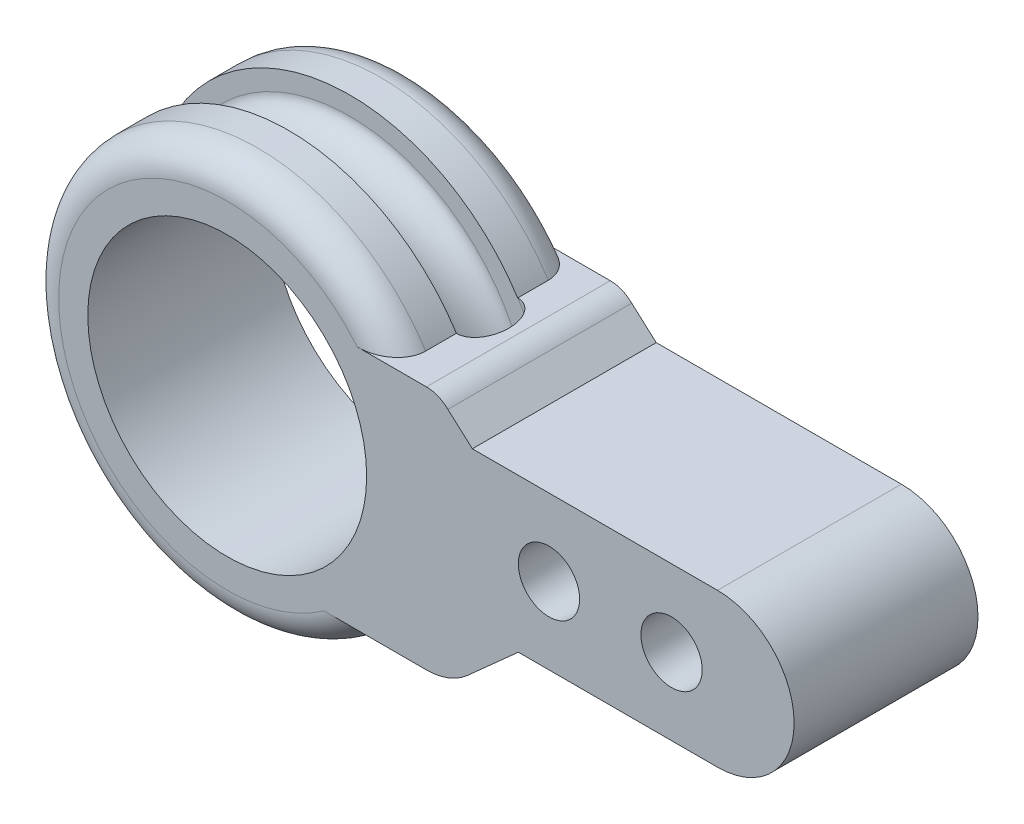
ISO-10303-21;
HEADER;
FILE_DESCRIPTION(('STEP AP214'),'2;1');
FILE_NAME('part.step','',(''),(''),'','','');
FILE_SCHEMA(('AUTOMOTIVE_DESIGN { 1 0 10303 214 1 1 1 1 }'));
ENDSEC;
DATA;
#1=APPLICATION_CONTEXT('core data for automotive mechanical design processes');
#2=APPLICATION_PROTOCOL_DEFINITION('international standard','automotive_design',2000,#1);
#3=PRODUCT_CONTEXT('',#1,'mechanical');
#4=PRODUCT('Part','Part','',(#3));
#5=PRODUCT_RELATED_PRODUCT_CATEGORY('part','',(#4));
#6=PRODUCT_DEFINITION_FORMATION('','',#4);
#7=PRODUCT_DEFINITION_CONTEXT('part definition',#1,'design');
#8=PRODUCT_DEFINITION('design','',#6,#7);
#9=PRODUCT_DEFINITION_SHAPE('','',#8);
#10=(LENGTH_UNIT() NAMED_UNIT(*) SI_UNIT(.MILLI.,.METRE.));
#11=(NAMED_UNIT(*) PLANE_ANGLE_UNIT() SI_UNIT($,.RADIAN.));
#12=(NAMED_UNIT(*) SI_UNIT($,.STERADIAN.) SOLID_ANGLE_UNIT());
#13=UNCERTAINTY_MEASURE_WITH_UNIT(LENGTH_MEASURE(1.E-05),#10,'distance_accuracy_value','');
#14=(GEOMETRIC_REPRESENTATION_CONTEXT(3) GLOBAL_UNCERTAINTY_ASSIGNED_CONTEXT((#13)) GLOBAL_UNIT_ASSIGNED_CONTEXT((#10,
#11,#12)) REPRESENTATION_CONTEXT('',''));
#15=CARTESIAN_POINT('',(0.,0.,0.));
#16=DIRECTION('',(0.,0.,1.));
#17=DIRECTION('',(1.,0.,0.));
#18=AXIS2_PLACEMENT_3D('',#15,#16,#17);
#19=CARTESIAN_POINT('',(4.69041575982343,-4.5,6.));
#20=DIRECTION('',(0.,1.,0.));
#21=DIRECTION('',(-1.,0.,0.));
#22=AXIS2_PLACEMENT_3D('',#19,#20,#21);
#23=PLANE('',#22);
#24=DIRECTION('',(1.,0.,0.));
#25=VECTOR('',#24,1.);
#26=CARTESIAN_POINT('',(4.69041575982343,-4.5,1.99843119348952));
#27=LINE('',#26,#25);
#28=CARTESIAN_POINT('',(4.69041575982343,-4.5,1.99843119348952));
#29=VERTEX_POINT('',#28);
#30=CARTESIAN_POINT('',(4.70292640209629,-4.5,1.99843119348952));
#31=VERTEX_POINT('',#30);
#32=EDGE_CURVE('E419',#29,#31,#27,.T.);
#33=ORIENTED_EDGE('',*,*,#32,.F.);
#34=DIRECTION('',(0.,0.,-1.));
#35=VECTOR('',#34,1.);
#36=CARTESIAN_POINT('',(4.69041575982343,-4.5,6.));
#37=LINE('',#36,#35);
#38=CARTESIAN_POINT('',(4.69041575982343,-4.5,1.));
#39=VERTEX_POINT('',#38);
#40=EDGE_CURVE('E268',#29,#39,#37,.T.);
#41=ORIENTED_EDGE('',*,*,#40,.T.);
#42=CARTESIAN_POINT('',(4.69041575982343,-4.5,1.));
#43=CARTESIAN_POINT('',(4.69041895160302,-4.5,0.977596962681445));
#44=CARTESIAN_POINT('',(4.68937157425843,-4.5,0.955207057747566));
#45=CARTESIAN_POINT('',(4.68521616480886,-4.5,0.910632809517849));
#46=CARTESIAN_POINT('',(4.68210939947018,-4.5,0.888448348350542));
#47=CARTESIAN_POINT('',(4.66982612496238,-4.5,0.822790708875952));
#48=CARTESIAN_POINT('',(4.65768511580106,-4.5,0.779841263067524));
#49=CARTESIAN_POINT('',(4.62632006257186,-4.5,0.696777562864503));
#50=CARTESIAN_POINT('',(4.60711079454571,-4.5,0.656657600513556));
#51=CARTESIAN_POINT('',(4.56266708575891,-4.5,0.579849110902098));
#52=CARTESIAN_POINT('',(4.53742118853803,-4.5,0.543167295161549));
#53=CARTESIAN_POINT('',(4.47226544089342,-4.5,0.461460940375679));
#54=CARTESIAN_POINT('',(4.43032431253609,-4.5,0.418058028759857));
#55=CARTESIAN_POINT('',(4.34001880309513,-4.5,0.338628278531945));
#56=CARTESIAN_POINT('',(4.29164651469831,-4.5,0.3026106612394));
#57=CARTESIAN_POINT('',(4.16946904904454,-4.5,0.224136153481156));
#58=CARTESIAN_POINT('',(4.09342300154608,-4.5,0.185182725976463));
#59=CARTESIAN_POINT('',(3.93602307554942,-4.5,0.119558493808312));
#60=CARTESIAN_POINT('',(3.85464673110043,-4.5,0.0929440795744107));
#61=CARTESIAN_POINT('',(3.67187471932509,-4.5,0.0459308111345104));
#62=CARTESIAN_POINT('',(3.56985290987806,-4.5,0.027997633010357));
#63=CARTESIAN_POINT('',(3.41657183091047,-4.5,0.010799396846525));
#64=CARTESIAN_POINT('',(3.36576389273019,-4.5,0.00667965331845016));
#65=CARTESIAN_POINT('',(3.26406573483153,-4.5,0.00128492215607739));
#66=CARTESIAN_POINT('',(3.21317572958382,-4.5,5.96381343863645E-06));
#67=CARTESIAN_POINT('',(3.16227766016838,-4.5,0.));
#68=B_SPLINE_CURVE_WITH_KNOTS('',3,(#42,#43,#44,#45,#46,#47,#48,#49,#50,#51,#52,#53,#54,#55,#56,
#57,#58,#59,#60,#61,#62,#63,#64,#65,#66,#67),.UNSPECIFIED.,.F.,.F.,(4,2,2,2,2,2,2,2,2,2,2,2,4),
(0.,0.0671595457267031,0.134277818706003,0.267415237717757,0.400275902561032,0.533390743304169,
0.71346268475732,0.893758113991914,1.14866535996151,1.40472634296297,1.71436429513972,
1.86723157216634,2.01988504409302),.UNSPECIFIED.);
#69=CARTESIAN_POINT('',(3.16227766016838,-4.5,0.));
#70=VERTEX_POINT('',#69);
#71=EDGE_CURVE('E47',#39,#70,#68,.T.);
#72=ORIENTED_EDGE('',*,*,#71,.T.);
#73=DIRECTION('',(1.,0.,0.));
#74=VECTOR('',#73,1.);
#75=CARTESIAN_POINT('',(4.69041575982343,-4.5,0.));
#76=LINE('',#75,#74);
#77=CARTESIAN_POINT('',(6.5,-4.5,0.));
#78=VERTEX_POINT('',#77);
#79=EDGE_CURVE('E54',#70,#78,#76,.T.);
#80=ORIENTED_EDGE('',*,*,#79,.T.);
#81=DIRECTION('',(0.,0.,-1.));
#82=VECTOR('',#81,1.);
#83=CARTESIAN_POINT('',(6.5,-4.5,6.));
#84=LINE('',#83,#82);
#85=CARTESIAN_POINT('',(6.5,-4.5,6.));
#86=VERTEX_POINT('',#85);
#87=EDGE_CURVE('E340',#86,#78,#84,.T.);
#88=ORIENTED_EDGE('',*,*,#87,.F.);
#89=DIRECTION('',(1.,0.,0.));
#90=VECTOR('',#89,1.);
#91=CARTESIAN_POINT('',(4.69041575982343,-4.5,6.));
#92=LINE('',#91,#90);
#93=CARTESIAN_POINT('',(3.16227766016838,-4.5,6.));
#94=VERTEX_POINT('',#93);
#95=EDGE_CURVE('E293',#94,#86,#92,.T.);
#96=ORIENTED_EDGE('',*,*,#95,.F.);
#97=CARTESIAN_POINT('',(3.16227766016838,-4.5,6.));
#98=CARTESIAN_POINT('',(3.23334602524907,-4.5,5.99998033821577));
#99=CARTESIAN_POINT('',(3.30448749517695,-4.5,5.99749182801016));
#100=CARTESIAN_POINT('',(3.44672645470219,-4.5,5.98672979872865));
#101=CARTESIAN_POINT('',(3.51782139924733,-4.5,5.97842350075403));
#102=CARTESIAN_POINT('',(3.65997427657541,-4.5,5.95499217687569));
#103=CARTESIAN_POINT('',(3.73101687861788,-4.5,5.93977050859863));
#104=CARTESIAN_POINT('',(3.87082373400252,-4.5,5.90150699790859));
#105=CARTESIAN_POINT('',(3.93959341888812,-4.5,5.87848554155266));
#106=CARTESIAN_POINT('',(4.06624410155655,-4.5,5.82651299870175));
#107=CARTESIAN_POINT('',(4.12449603988664,-4.5,5.79847874236156));
#108=CARTESIAN_POINT('',(4.23646619167923,-4.5,5.73462258342951));
#109=CARTESIAN_POINT('',(4.29019492578419,-4.5,5.69881948655014));
#110=CARTESIAN_POINT('',(4.3918287901696,-4.5,5.61825053952235));
#111=CARTESIAN_POINT('',(4.43964083033386,-4.5,5.57336511248957));
#112=CARTESIAN_POINT('',(4.52542100161149,-4.5,5.47495257830984));
#113=CARTESIAN_POINT('',(4.5634127753495,-4.5,5.42144673940803));
#114=CARTESIAN_POINT('',(4.61540416021045,-4.5,5.32652159446845));
#115=CARTESIAN_POINT('',(4.63317141884252,-4.5,5.2871489894753));
#116=CARTESIAN_POINT('',(4.66188879039873,-4.5,5.20601656977274));
#117=CARTESIAN_POINT('',(4.6728530888088,-4.5,5.16426192209058));
#118=CARTESIAN_POINT('',(4.68350626076316,-4.5,5.10177738521324));
#119=CARTESIAN_POINT('',(4.68609279998752,-4.5,5.08150807302189));
#120=CARTESIAN_POINT('',(4.6895480146711,-4.5,5.04082953434972));
#121=CARTESIAN_POINT('',(4.69041717600019,-4.5,5.02042034908106));
#122=CARTESIAN_POINT('',(4.69041575982343,-4.5,5.));
#123=B_SPLINE_CURVE_WITH_KNOTS('',3,(#97,#98,#99,#100,#101,#102,#103,#104,#105,#106,#107,#108,
#109,#110,#111,#112,#113,#114,#115,#116,#117,#118,#119,#120,#121,#122),.UNSPECIFIED.,.F.,.F.,(4,
2,2,2,2,2,2,2,2,2,2,2,4),(0.,0.213273306136751,0.427758017013181,0.645337015500823,
0.862351666366933,1.05577156620666,1.24872838422298,1.44441366042992,1.63962333486838,
1.76869656026797,1.89749973050446,1.9587380109012,2.01995896366226),.UNSPECIFIED.);
#124=CARTESIAN_POINT('',(4.69041575982343,-4.5,5.));
#125=VERTEX_POINT('',#124);
#126=EDGE_CURVE('E245',#94,#125,#123,.T.);
#127=ORIENTED_EDGE('',*,*,#126,.T.);
#128=CARTESIAN_POINT('',(4.69041575982343,-4.5,3.99843119348952));
#129=VERTEX_POINT('',#128);
#130=EDGE_CURVE('E281',#125,#129,#37,.T.);
#131=ORIENTED_EDGE('',*,*,#130,.T.);
#132=DIRECTION('',(-1.,0.,0.));
#133=VECTOR('',#132,1.);
#134=CARTESIAN_POINT('',(4.69041575982343,-4.5,3.99843119348952));
#135=LINE('',#134,#133);
#136=CARTESIAN_POINT('',(4.70292640209629,-4.5,3.99843119348952));
#137=VERTEX_POINT('',#136);
#138=EDGE_CURVE('E163',#137,#129,#135,.T.);
#139=ORIENTED_EDGE('',*,*,#138,.F.);
#140=CARTESIAN_POINT('',(4.70292640209629,-4.5,3.99843119348952));
#141=CARTESIAN_POINT('',(4.72207468590351,-4.5,3.99843271973142));
#142=CARTESIAN_POINT('',(4.74121543834601,-4.5,3.99763288816709));
#143=CARTESIAN_POINT('',(4.77935975373242,-4.5,3.99442474316628));
#144=CARTESIAN_POINT('',(4.79836332853766,-4.5,3.9920165705236));
#145=CARTESIAN_POINT('',(4.85481016934785,-4.5,3.98240134539255));
#146=CARTESIAN_POINT('',(4.89187442163675,-4.5,3.97280363814264));
#147=CARTESIAN_POINT('',(4.96389349180584,-4.5,3.9475660861733));
#148=CARTESIAN_POINT('',(4.9988462152444,-4.5,3.93192035256708));
#149=CARTESIAN_POINT('',(5.06582307625507,-4.5,3.89527247052552));
#150=CARTESIAN_POINT('',(5.09784573004788,-4.5,3.87426762842528));
#151=CARTESIAN_POINT('',(5.160105241582,-4.5,3.82646198950584));
#152=CARTESIAN_POINT('',(5.19014275559974,-4.5,3.79940318682905));
#153=CARTESIAN_POINT('',(5.24605900916883,-4.5,3.74128624906075));
#154=CARTESIAN_POINT('',(5.27193407593936,-4.5,3.71022462508352));
#155=CARTESIAN_POINT('',(5.32981505981013,-4.49999999999999,3.63078057260934));
#156=CARTESIAN_POINT('',(5.35957151279928,-4.5,3.58075320388895));
#157=CARTESIAN_POINT('',(5.4105568749744,-4.5,3.47650824115331));
#158=CARTESIAN_POINT('',(5.43176952929273,-4.5,3.42228289172068));
#159=CARTESIAN_POINT('',(5.46620618165703,-4.5,3.31058945504277));
#160=CARTESIAN_POINT('',(5.47932081755871,-4.5,3.25308796620198));
#161=CARTESIAN_POINT('',(5.49740336618089,-4.5,3.13684066750762));
#162=CARTESIAN_POINT('',(5.50236924315946,-4.5,3.07809455042982));
#163=CARTESIAN_POINT('',(5.50444749408797,-4.5,2.94918311772712));
#164=CARTESIAN_POINT('',(5.49988043192396,-4.5,2.87897788356932));
#165=CARTESIAN_POINT('',(5.48438422066897,-4.5,2.77505322904287));
#166=CARTESIAN_POINT('',(5.47777697614783,-4.5,2.74063942027466));
#167=CARTESIAN_POINT('',(5.46161164767258,-4.5,2.67245696694464));
#168=CARTESIAN_POINT('',(5.45204958425334,-4.5,2.63868925805532));
#169=CARTESIAN_POINT('',(5.42313927085772,-4.5,2.55181527365808));
#170=CARTESIAN_POINT('',(5.40138005963799,-4.5,2.49948404430528));
#171=CARTESIAN_POINT('',(5.34973106850188,-4.5,2.39905643090719));
#172=CARTESIAN_POINT('',(5.31985720578898,-4.5,2.35095199778716));
#173=CARTESIAN_POINT('',(5.25857196679343,-4.5,2.26992120421374));
#174=CARTESIAN_POINT('',(5.22864371462777,-4.5,2.23587766227944));
#175=CARTESIAN_POINT('',(5.16360038452457,-4.5,2.17312882273309));
#176=CARTESIAN_POINT('',(5.12848813479098,-4.5,2.14442063351282));
#177=CARTESIAN_POINT('',(5.0533176675696,-4.5,2.0935841153982));
#178=CARTESIAN_POINT('',(5.01322102475276,-4.5,2.07151204194681));
#179=CARTESIAN_POINT('',(4.92947886640111,-4.5,2.03566013697044));
#180=CARTESIAN_POINT('',(4.88583844254941,-4.5,2.02186863915999));
#181=CARTESIAN_POINT('',(4.81855408290306,-4.5,2.00787768386837));
#182=CARTESIAN_POINT('',(4.79556138993356,-4.49999999999999,2.00432958298985));
#183=CARTESIAN_POINT('',(4.74935851983353,-4.5,1.99960571947351));
#184=CARTESIAN_POINT('',(4.72614860689936,-4.50000000000002,1.99842737678428));
#185=CARTESIAN_POINT('',(4.70292640209645,-4.50000000000005,1.99843119348952));
#186=B_SPLINE_CURVE_WITH_KNOTS('',3,(#140,#141,#142,#143,#144,#145,#146,#147,#148,#149,#150,
#151,#152,#153,#154,#155,#156,#157,#158,#159,#160,#161,#162,#163,#164,#165,#166,#167,#168,#169,
#170,#171,#172,#173,#174,#175,#176,#177,#178,#179,#180,#181,#182,#183,#184,#185),.UNSPECIFIED.,
.F.,.F.,(4,2,2,2,2,2,2,2,2,2,2,2,2,2,2,2,2,2,2,2,2,2,4),(0.,0.0574123165189089,
0.114819607835953,0.229086746463998,0.34346542695295,0.457901711594274,0.57872331219648,
0.699650943138519,0.873330741760275,1.0473394287376,1.22364942249786,1.40000345572942,
1.61000957905854,1.71503002024462,1.82019252095396,1.98953592110764,2.15854951687747,
2.29400344121919,2.42938373795599,2.5658812607857,2.70218602181477,2.77187272151152,
2.84148350932177),.UNSPECIFIED.);
#187=EDGE_CURVE('E172',#137,#31,#186,.T.);
#188=ORIENTED_EDGE('',*,*,#187,.T.);
#189=EDGE_LOOP('',(#33,#41,#72,#80,#88,#96,#127,#131,#139,#188));
#190=FACE_BOUND('',#189,.T.);
#191=ADVANCED_FACE('F33',(#190),#23,.F.);
#192=CARTESIAN_POINT('',(6.5,3.5,6.));
#193=DIRECTION('',(0.,-1.,0.));
#194=DIRECTION('',(0.,0.,-1.));
#195=AXIS2_PLACEMENT_3D('',#192,#193,#194);
#196=PLANE('',#195);
#197=DIRECTION('',(-1.,0.,0.));
#198=VECTOR('',#197,1.);
#199=CARTESIAN_POINT('',(6.5,3.5,1.99843119348952));
#200=LINE('',#199,#198);
#201=CARTESIAN_POINT('',(5.48794285170084,3.5,1.99843119348952));
#202=VERTEX_POINT('',#201);
#203=CARTESIAN_POINT('',(5.47722557505166,3.5,1.99843119348952));
#204=VERTEX_POINT('',#203);
#205=EDGE_CURVE('E178',#202,#204,#200,.T.);
#206=ORIENTED_EDGE('',*,*,#205,.F.);
#207=CARTESIAN_POINT('',(5.48794285170084,3.5,1.99843119348952));
#208=CARTESIAN_POINT('',(5.50334077697644,3.4999999999999,1.9984286766703));
#209=CARTESIAN_POINT('',(5.51873038447994,3.49999999999995,1.99913415339519));
#210=CARTESIAN_POINT('',(5.54937369955001,3.50000000000005,2.00194097097522));
#211=CARTESIAN_POINT('',(5.56462747474249,3.5000000000001,2.00404157273644));
#212=CARTESIAN_POINT('',(5.6097774594412,3.4999999999998,2.01236035954246));
#213=CARTESIAN_POINT('',(5.6393236851537,3.49999999999903,2.02059633730872));
#214=CARTESIAN_POINT('',(5.69498668064814,3.49999999999904,2.04132870959261));
#215=CARTESIAN_POINT('',(5.72120270115804,3.49999999999974,2.05356563565131));
#216=CARTESIAN_POINT('',(5.77159901382026,3.50000000000026,2.08173744713488));
#217=CARTESIAN_POINT('',(5.79577582494572,3.50000000000008,2.09767848822722));
#218=CARTESIAN_POINT('',(5.85241785634997,3.49999999999988,2.14061564336957));
#219=CARTESIAN_POINT('',(5.8835852755012,3.49999999999997,2.16932534800375));
#220=CARTESIAN_POINT('',(5.94090551535545,3.50000000000003,2.2313753385966));
#221=CARTESIAN_POINT('',(5.96704720825796,3.50000000000001,2.26472562463979));
#222=CARTESIAN_POINT('',(6.02411747447867,3.49999999999998,2.34880985441148));
#223=CARTESIAN_POINT('',(6.05271289835628,3.49999999999999,2.4011233160703));
#224=CARTESIAN_POINT('',(6.10128344964254,3.5,2.50956187065349));
#225=CARTESIAN_POINT('',(6.12124610661421,3.5,2.5656923429724));
#226=CARTESIAN_POINT('',(6.15832025899222,3.5,2.69816835013827));
#227=CARTESIAN_POINT('',(6.17256010857777,3.5,2.77531920808124));
#228=CARTESIAN_POINT('',(6.18832586450009,3.5,2.93095971860675));
#229=CARTESIAN_POINT('',(6.18983212715318,3.5,3.00945125258897));
#230=CARTESIAN_POINT('',(6.18014917709243,3.5,3.16645897407841));
#231=CARTESIAN_POINT('',(6.16883160039567,3.5,3.24496740537847));
#232=CARTESIAN_POINT('',(6.13253704281409,3.5,3.39873058057227));
#233=CARTESIAN_POINT('',(6.10759624782825,3.49999999999999,3.47399337658704));
#234=CARTESIAN_POINT('',(6.05542227638354,3.5,3.58917721587477));
#235=CARTESIAN_POINT('',(6.0330064712661,3.5,3.63129286368753));
#236=CARTESIAN_POINT('',(5.98215475934092,3.5,3.71174513770186));
#237=CARTESIAN_POINT('',(5.95372752285852,3.5,3.75008709124759));
#238=CARTESIAN_POINT('',(5.89760733348578,3.5,3.81317205388966));
#239=CARTESIAN_POINT('',(5.87118047367267,3.5,3.83903612248418));
#240=CARTESIAN_POINT('',(5.81450546384123,3.5,3.88620516967662));
#241=CARTESIAN_POINT('',(5.78426195998072,3.5,3.90751560804633));
#242=CARTESIAN_POINT('',(5.72601965749903,3.5,3.94095882641076));
#243=CARTESIAN_POINT('',(5.69857196393368,3.5,3.95404859436561));
#244=CARTESIAN_POINT('',(5.64188554740443,3.5,3.97544930427055));
#245=CARTESIAN_POINT('',(5.61265019978921,3.5,3.98376896225516));
#246=CARTESIAN_POINT('',(5.56728751642629,3.5,3.99242267824039));
#247=CARTESIAN_POINT('',(5.55150642238929,3.5,3.99467261887462));
#248=CARTESIAN_POINT('',(5.51980071183317,3.5,3.9976785911847));
#249=CARTESIAN_POINT('',(5.50387607697789,3.5,3.99843442920462));
#250=CARTESIAN_POINT('',(5.48794285170084,3.5,3.99843119348952));
#251=B_SPLINE_CURVE_WITH_KNOTS('',3,(#207,#208,#209,#210,#211,#212,#213,#214,#215,#216,#217,
#218,#219,#220,#221,#222,#223,#224,#225,#226,#227,#228,#229,#230,#231,#232,#233,#234,#235,#236,
#237,#238,#239,#240,#241,#242,#243,#244,#245,#246,#247,#248,#249,#250),.UNSPECIFIED.,.F.,.F.,(4,
2,2,2,2,2,2,2,2,2,2,2,2,2,2,2,2,2,2,2,2,4),(0.,0.0461613460436265,0.0922982567252823,
0.183799597253196,0.270264260634804,0.356873655808186,0.483290182954039,0.609983472664503,
0.787863229072435,0.965999089704198,1.20016381297026,1.43468970862082,1.67158405832455,
1.90785220931492,2.05057454370532,2.19309241589198,2.30363635946471,2.41404700850557,
2.5049029836907,2.59559241168007,2.64335125622968,2.69111629056712),.UNSPECIFIED.);
#252=CARTESIAN_POINT('',(5.48794285170084,3.5,3.99843119348952));
#253=VERTEX_POINT('',#252);
#254=EDGE_CURVE('E169',#202,#253,#251,.T.);
#255=ORIENTED_EDGE('',*,*,#254,.T.);
#256=DIRECTION('',(1.,0.,0.));
#257=VECTOR('',#256,1.);
#258=CARTESIAN_POINT('',(6.5,3.5,3.99843119348952));
#259=LINE('',#258,#257);
#260=CARTESIAN_POINT('',(5.47722557505166,3.5,3.99843119348952));
#261=VERTEX_POINT('',#260);
#262=EDGE_CURVE('E153',#261,#253,#259,.T.);
#263=ORIENTED_EDGE('',*,*,#262,.F.);
#264=DIRECTION('',(0.,0.,-1.));
#265=VECTOR('',#264,1.);
#266=CARTESIAN_POINT('',(5.47722557505166,3.5,6.));
#267=LINE('',#266,#265);
#268=CARTESIAN_POINT('',(5.47722557505166,3.5,5.));
#269=VERTEX_POINT('',#268);
#270=EDGE_CURVE('E280',#269,#261,#267,.T.);
#271=ORIENTED_EDGE('',*,*,#270,.F.);
#272=CARTESIAN_POINT('',(5.47722557505166,3.5,5.));
#273=CARTESIAN_POINT('',(5.47722727345927,3.5,5.02482597162928));
#274=CARTESIAN_POINT('',(5.4761276039089,3.5,5.04963888889782));
#275=CARTESIAN_POINT('',(5.47175345223214,3.5,5.09906413668013));
#276=CARTESIAN_POINT('',(5.46847969448916,3.5,5.12367653124193));
#277=CARTESIAN_POINT('',(5.45548371179124,3.5,5.1967195261964));
#278=CARTESIAN_POINT('',(5.4425860980724,3.5,5.24462017419115));
#279=CARTESIAN_POINT('',(5.40896635679638,3.5,5.337494330896));
#280=CARTESIAN_POINT('',(5.38825091559466,3.5,5.38247030256785));
#281=CARTESIAN_POINT('',(5.339913336373,3.5,5.46856800868375));
#282=CARTESIAN_POINT('',(5.3122855841696,3.5,5.50968657263018));
#283=CARTESIAN_POINT('',(5.24963949099176,3.5,5.58929574651323));
#284=CARTESIAN_POINT('',(5.21431553067186,3.5,5.62754454602363));
#285=CARTESIAN_POINT('',(5.13848798324781,3.5,5.69847518812329));
#286=CARTESIAN_POINT('',(5.09798282029464,3.5,5.73115532993829));
#287=CARTESIAN_POINT('',(5.0067570022192,3.5,5.79510397836177));
#288=CARTESIAN_POINT('',(4.95540775109005,3.5,5.82547348871648));
#289=CARTESIAN_POINT('',(4.84895112345609,3.5,5.87869913120839));
#290=CARTESIAN_POINT('',(4.79384060453406,3.5,5.90154888571485));
#291=CARTESIAN_POINT('',(4.67070752983387,3.5,5.94351293644582));
#292=CARTESIAN_POINT('',(4.60218394694625,3.5,5.96115162923286));
#293=CARTESIAN_POINT('',(4.46343272792774,3.5,5.98672647500445));
#294=CARTESIAN_POINT('',(4.39320628603927,3.5,5.99466923802688));
#295=CARTESIAN_POINT('',(4.29609628419264,3.5,5.99936249880021));
#296=CARTESIAN_POINT('',(4.26936190818343,3.5,5.99999981994959));
#297=CARTESIAN_POINT('',(4.24264068711929,3.5,6.));
#298=B_SPLINE_CURVE_WITH_KNOTS('',3,(#272,#273,#274,#275,#276,#277,#278,#279,#280,#281,#282,
#283,#284,#285,#286,#287,#288,#289,#290,#291,#292,#293,#294,#295,#296,#297),.UNSPECIFIED.,.F.,
.F.,(4,2,2,2,2,2,2,2,2,2,2,2,4),(0.,0.0744281761309019,0.148831566006712,0.296856569915755,
0.444755258301425,0.592774462281992,0.748360757848235,0.903994487593924,1.08229794419715,
1.26075223555043,1.47225731373691,1.68361812120502,1.76380620038183),.UNSPECIFIED.);
#299=CARTESIAN_POINT('',(4.24264068711929,3.5,6.));
#300=VERTEX_POINT('',#299);
#301=EDGE_CURVE('E252',#269,#300,#298,.T.);
#302=ORIENTED_EDGE('',*,*,#301,.T.);
#303=DIRECTION('',(-1.,0.,0.));
#304=VECTOR('',#303,1.);
#305=CARTESIAN_POINT('',(6.5,3.5,6.));
#306=LINE('',#305,#304);
#307=CARTESIAN_POINT('',(6.5,3.5,6.));
#308=VERTEX_POINT('',#307);
#309=EDGE_CURVE('E294',#308,#300,#306,.T.);
#310=ORIENTED_EDGE('',*,*,#309,.F.);
#311=DIRECTION('',(0.,0.,-1.));
#312=VECTOR('',#311,1.);
#313=CARTESIAN_POINT('',(6.5,3.5,6.));
#314=LINE('',#313,#312);
#315=CARTESIAN_POINT('',(6.5,3.5,0.));
#316=VERTEX_POINT('',#315);
#317=EDGE_CURVE('E287',#308,#316,#314,.T.);
#318=ORIENTED_EDGE('',*,*,#317,.T.);
#319=DIRECTION('',(-1.,0.,0.));
#320=VECTOR('',#319,1.);
#321=CARTESIAN_POINT('',(6.5,3.5,0.));
#322=LINE('',#321,#320);
#323=CARTESIAN_POINT('',(4.24264068711929,3.5,0.));
#324=VERTEX_POINT('',#323);
#325=EDGE_CURVE('E61',#316,#324,#322,.T.);
#326=ORIENTED_EDGE('',*,*,#325,.T.);
#327=CARTESIAN_POINT('',(4.24264068711929,3.5,0.));
#328=CARTESIAN_POINT('',(4.32697312698623,3.5,-1.59920253766429E-05));
#329=CARTESIAN_POINT('',(4.41159415798979,3.5,0.00635656938471207));
#330=CARTESIAN_POINT('',(4.57921785143664,3.5,0.0329375592104392));
#331=CARTESIAN_POINT('',(4.66220460040228,3.5,0.0532446665360328));
#332=CARTESIAN_POINT('',(4.80674274510003,3.5,0.103143223878386));
#333=CARTESIAN_POINT('',(4.86922487761615,3.5,0.130011917378215));
#334=CARTESIAN_POINT('',(4.98887256817179,3.5,0.193492066078539));
#335=CARTESIAN_POINT('',(5.04605417779447,3.5,0.230072717250642));
#336=CARTESIAN_POINT('',(5.14444417751577,3.5,0.306352640327293));
#337=CARTESIAN_POINT('',(5.18674742991551,3.5,0.344636156773917));
#338=CARTESIAN_POINT('',(5.26449503957788,3.5,0.427721009439152));
#339=CARTESIAN_POINT('',(5.29993711722129,3.5,0.472524503283217));
#340=CARTESIAN_POINT('',(5.3624717392945,3.5,0.568102524603832));
#341=CARTESIAN_POINT('',(5.38950543798692,3.5,0.61891584433738));
#342=CARTESIAN_POINT('',(5.43327891671085,3.5,0.724768844446677));
#343=CARTESIAN_POINT('',(5.45003851147954,3.5,0.779800157762744));
#344=CARTESIAN_POINT('',(5.4664711680219,3.5,0.862907552022354));
#345=CARTESIAN_POINT('',(5.47049804525844,3.5,0.890179447944299));
#346=CARTESIAN_POINT('',(5.4758750872911,3.5,0.94496140579552));
#347=CARTESIAN_POINT('',(5.4772275970037,3.5,0.972471237820086));
#348=CARTESIAN_POINT('',(5.47722557505166,3.5,1.));
#349=B_SPLINE_CURVE_WITH_KNOTS('',3,(#327,#328,#329,#330,#331,#332,#333,#334,#335,#336,#337,
#338,#339,#340,#341,#342,#343,#344,#345,#346,#347,#348),.UNSPECIFIED.,.F.,.F.,(4,2,2,2,2,2,2,2,
2,2,4),(0.,0.253226166988847,0.508264342569242,0.711512319759814,0.914123188389221,
1.08458629603655,1.25510594306133,1.42679342586097,1.59814874014279,1.68073759340717,
1.76325399963867),.UNSPECIFIED.);
#350=CARTESIAN_POINT('',(5.47722557505166,3.5,1.));
#351=VERTEX_POINT('',#350);
#352=EDGE_CURVE('E11',#324,#351,#349,.T.);
#353=ORIENTED_EDGE('',*,*,#352,.T.);
#354=EDGE_CURVE('E288',#204,#351,#267,.T.);
#355=ORIENTED_EDGE('',*,*,#354,.F.);
#356=EDGE_LOOP('',(#206,#255,#263,#271,#302,#310,#318,#326,#353,#355));
#357=FACE_BOUND('',#356,.T.);
#358=ADVANCED_FACE('F176',(#357),#196,.F.);
#359=CARTESIAN_POINT('',(0.,0.,6.));
#360=DIRECTION('',(0.,0.,-1.));
#361=DIRECTION('',(-1.,0.,0.));
#362=AXIS2_PLACEMENT_3D('',#359,#360,#361);
#363=CYLINDRICAL_SURFACE('',#362,6.5);
#364=ORIENTED_EDGE('',*,*,#354,.T.);
#365=CARTESIAN_POINT('',(0.,0.,1.));
#366=DIRECTION('',(0.,0.,1.));
#367=DIRECTION('',(1.,0.,0.));
#368=AXIS2_PLACEMENT_3D('',#365,#366,#367);
#369=CIRCLE('',#368,6.5);
#370=EDGE_CURVE('E273',#351,#39,#369,.T.);
#371=ORIENTED_EDGE('',*,*,#370,.T.);
#372=ORIENTED_EDGE('',*,*,#40,.F.);
#373=CARTESIAN_POINT('',(0.,0.,1.99843119348952));
#374=DIRECTION('',(0.,0.,1.));
#375=DIRECTION('',(1.,0.,0.));
#376=AXIS2_PLACEMENT_3D('',#373,#374,#375);
#377=CIRCLE('',#376,6.5);
#378=EDGE_CURVE('E180',#204,#29,#377,.T.);
#379=ORIENTED_EDGE('',*,*,#378,.F.);
#380=EDGE_LOOP('',(#364,#371,#372,#379));
#381=FACE_BOUND('',#380,.T.);
#382=ADVANCED_FACE('F228',(#381),#363,.T.);
#383=ORIENTED_EDGE('',*,*,#130,.F.);
#384=CARTESIAN_POINT('',(0.,0.,5.));
#385=DIRECTION('',(0.,0.,1.));
#386=DIRECTION('',(1.,0.,0.));
#387=AXIS2_PLACEMENT_3D('',#384,#385,#386);
#388=CIRCLE('',#387,6.5);
#389=EDGE_CURVE('E183',#125,#269,#388,.F.);
#390=ORIENTED_EDGE('',*,*,#389,.T.);
#391=ORIENTED_EDGE('',*,*,#270,.T.);
#392=CARTESIAN_POINT('',(0.,0.,3.99843119348952));
#393=DIRECTION('',(0.,0.,-1.));
#394=DIRECTION('',(-1.,0.,0.));
#395=AXIS2_PLACEMENT_3D('',#392,#393,#394);
#396=CIRCLE('',#395,6.5);
#397=EDGE_CURVE('E160',#129,#261,#396,.T.);
#398=ORIENTED_EDGE('',*,*,#397,.F.);
#399=EDGE_LOOP('',(#383,#390,#391,#398));
#400=FACE_BOUND('',#399,.T.);
#401=ADVANCED_FACE('F279',(#400),#363,.T.);
#402=CARTESIAN_POINT('',(6.5,-2.5,6.));
#403=DIRECTION('',(0.,0.,-1.));
#404=DIRECTION('',(-1.,0.,0.));
#405=AXIS2_PLACEMENT_3D('',#402,#403,#404);
#406=CYLINDRICAL_SURFACE('',#405,2.);
#407=CARTESIAN_POINT('',(6.5,-2.5,0.));
#408=DIRECTION('',(0.,0.,1.));
#409=DIRECTION('',(1.,0.,0.));
#410=AXIS2_PLACEMENT_3D('',#407,#408,#409);
#411=CIRCLE('',#410,2.);
#412=CARTESIAN_POINT('',(7.83333333333333,-3.99071198499986,0.));
#413=VERTEX_POINT('',#412);
#414=EDGE_CURVE('E305',#78,#413,#411,.T.);
#415=ORIENTED_EDGE('',*,*,#414,.T.);
#416=DIRECTION('',(0.,0.,-1.));
#417=VECTOR('',#416,1.);
#418=CARTESIAN_POINT('',(7.83333333333333,-3.99071198499986,6.));
#419=LINE('',#418,#417);
#420=CARTESIAN_POINT('',(7.83333333333333,-3.99071198499986,6.));
#421=VERTEX_POINT('',#420);
#422=EDGE_CURVE('E338',#421,#413,#419,.T.);
#423=ORIENTED_EDGE('',*,*,#422,.F.);
#424=CARTESIAN_POINT('',(6.5,-2.5,6.));
#425=DIRECTION('',(0.,0.,1.));
#426=DIRECTION('',(1.,0.,0.));
#427=AXIS2_PLACEMENT_3D('',#424,#425,#426);
#428=CIRCLE('',#427,2.);
#429=EDGE_CURVE('E344',#86,#421,#428,.T.);
#430=ORIENTED_EDGE('',*,*,#429,.F.);
#431=ORIENTED_EDGE('',*,*,#87,.T.);
#432=EDGE_LOOP('',(#415,#423,#430,#431));
#433=FACE_BOUND('',#432,.T.);
#434=ADVANCED_FACE('F232',(#433),#406,.T.);
#435=CARTESIAN_POINT('',(9.5,-2.5,6.));
#436=DIRECTION('',(0.666666666666667,-0.74535599249993,0.));
#437=DIRECTION('',(0.74535599249993,0.666666666666667,0.));
#438=AXIS2_PLACEMENT_3D('',#435,#436,#437);
#439=PLANE('',#438);
#440=DIRECTION('',(-0.74535599249993,-0.666666666666667,0.));
#441=VECTOR('',#440,1.);
#442=CARTESIAN_POINT('',(9.5,-2.5,0.));
#443=LINE('',#442,#441);
#444=CARTESIAN_POINT('',(9.5,-2.5,0.));
#445=VERTEX_POINT('',#444);
#446=EDGE_CURVE('E309',#445,#413,#443,.T.);
#447=ORIENTED_EDGE('',*,*,#446,.F.);
#448=DIRECTION('',(0.,0.,-1.));
#449=VECTOR('',#448,1.);
#450=CARTESIAN_POINT('',(9.5,-2.5,6.));
#451=LINE('',#450,#449);
#452=CARTESIAN_POINT('',(9.5,-2.5,6.));
#453=VERTEX_POINT('',#452);
#454=EDGE_CURVE('E336',#453,#445,#451,.T.);
#455=ORIENTED_EDGE('',*,*,#454,.F.);
#456=DIRECTION('',(-0.74535599249993,-0.666666666666667,0.));
#457=VECTOR('',#456,1.);
#458=CARTESIAN_POINT('',(9.5,-2.5,6.));
#459=LINE('',#458,#457);
#460=EDGE_CURVE('E346',#453,#421,#459,.T.);
#461=ORIENTED_EDGE('',*,*,#460,.T.);
#462=ORIENTED_EDGE('',*,*,#422,.T.);
#463=EDGE_LOOP('',(#447,#455,#461,#462));
#464=FACE_BOUND('',#463,.T.);
#465=ADVANCED_FACE('F383',(#464),#439,.T.);
#466=CARTESIAN_POINT('',(9.5,-2.5,6.));
#467=DIRECTION('',(0.,1.,0.));
#468=DIRECTION('',(0.,0.,1.));
#469=AXIS2_PLACEMENT_3D('',#466,#467,#468);
#470=PLANE('',#469);
#471=DIRECTION('',(1.,0.,0.));
#472=VECTOR('',#471,1.);
#473=CARTESIAN_POINT('',(9.5,-2.5,0.));
#474=LINE('',#473,#472);
#475=CARTESIAN_POINT('',(16.,-2.5,0.));
#476=VERTEX_POINT('',#475);
#477=EDGE_CURVE('E312',#445,#476,#474,.T.);
#478=ORIENTED_EDGE('',*,*,#477,.T.);
#479=DIRECTION('',(0.,0.,-1.));
#480=VECTOR('',#479,1.);
#481=CARTESIAN_POINT('',(16.,-2.5,6.));
#482=LINE('',#481,#480);
#483=CARTESIAN_POINT('',(16.,-2.5,6.));
#484=VERTEX_POINT('',#483);
#485=EDGE_CURVE('E333',#484,#476,#482,.T.);
#486=ORIENTED_EDGE('',*,*,#485,.F.);
#487=DIRECTION('',(1.,0.,0.));
#488=VECTOR('',#487,1.);
#489=CARTESIAN_POINT('',(9.5,-2.5,6.));
#490=LINE('',#489,#488);
#491=EDGE_CURVE('E354',#453,#484,#490,.T.);
#492=ORIENTED_EDGE('',*,*,#491,.F.);
#493=ORIENTED_EDGE('',*,*,#454,.T.);
#494=EDGE_LOOP('',(#478,#486,#492,#493));
#495=FACE_BOUND('',#494,.T.);
#496=ADVANCED_FACE('F386',(#495),#470,.F.);
#497=CARTESIAN_POINT('',(16.,0.,6.));
#498=DIRECTION('',(0.,0.,-1.));
#499=DIRECTION('',(-1.,0.,0.));
#500=AXIS2_PLACEMENT_3D('',#497,#498,#499);
#501=CYLINDRICAL_SURFACE('',#500,2.5);
#502=CARTESIAN_POINT('',(16.,0.,0.));
#503=DIRECTION('',(0.,0.,1.));
#504=DIRECTION('',(1.,0.,0.));
#505=AXIS2_PLACEMENT_3D('',#502,#503,#504);
#506=CIRCLE('',#505,2.5);
#507=CARTESIAN_POINT('',(16.,2.5,0.));
#508=VERTEX_POINT('',#507);
#509=EDGE_CURVE('E314',#476,#508,#506,.T.);
#510=ORIENTED_EDGE('',*,*,#509,.T.);
#511=DIRECTION('',(0.,0.,-1.));
#512=VECTOR('',#511,1.);
#513=CARTESIAN_POINT('',(16.,2.5,6.));
#514=LINE('',#513,#512);
#515=CARTESIAN_POINT('',(16.,2.5,6.));
#516=VERTEX_POINT('',#515);
#517=EDGE_CURVE('E331',#516,#508,#514,.T.);
#518=ORIENTED_EDGE('',*,*,#517,.F.);
#519=CARTESIAN_POINT('',(16.,0.,6.));
#520=DIRECTION('',(0.,0.,1.));
#521=DIRECTION('',(1.,0.,0.));
#522=AXIS2_PLACEMENT_3D('',#519,#520,#521);
#523=CIRCLE('',#522,2.5);
#524=EDGE_CURVE('E356',#484,#516,#523,.T.);
#525=ORIENTED_EDGE('',*,*,#524,.F.);
#526=ORIENTED_EDGE('',*,*,#485,.T.);
#527=EDGE_LOOP('',(#510,#518,#525,#526));
#528=FACE_BOUND('',#527,.T.);
#529=ADVANCED_FACE('F377',(#528),#501,.T.);
#530=CARTESIAN_POINT('',(8.,2.5,6.));
#531=DIRECTION('',(0.,1.,0.));
#532=DIRECTION('',(0.,0.,1.));
#533=AXIS2_PLACEMENT_3D('',#530,#531,#532);
#534=PLANE('',#533);
#535=DIRECTION('',(1.,0.,0.));
#536=VECTOR('',#535,1.);
#537=CARTESIAN_POINT('',(8.,2.5,0.));
#538=LINE('',#537,#536);
#539=CARTESIAN_POINT('',(8.,2.5,0.));
#540=VERTEX_POINT('',#539);
#541=EDGE_CURVE('E317',#540,#508,#538,.T.);
#542=ORIENTED_EDGE('',*,*,#541,.F.);
#543=DIRECTION('',(0.,0.,-1.));
#544=VECTOR('',#543,1.);
#545=CARTESIAN_POINT('',(8.,2.5,6.));
#546=LINE('',#545,#544);
#547=CARTESIAN_POINT('',(8.,2.5,6.));
#548=VERTEX_POINT('',#547);
#549=EDGE_CURVE('E329',#548,#540,#546,.T.);
#550=ORIENTED_EDGE('',*,*,#549,.F.);
#551=DIRECTION('',(1.,0.,0.));
#552=VECTOR('',#551,1.);
#553=CARTESIAN_POINT('',(8.,2.5,6.));
#554=LINE('',#553,#552);
#555=EDGE_CURVE('E358',#548,#516,#554,.T.);
#556=ORIENTED_EDGE('',*,*,#555,.T.);
#557=ORIENTED_EDGE('',*,*,#517,.T.);
#558=EDGE_LOOP('',(#542,#550,#556,#557));
#559=FACE_BOUND('',#558,.T.);
#560=ADVANCED_FACE('F373',(#559),#534,.T.);
#561=CARTESIAN_POINT('',(8.,2.5,6.));
#562=DIRECTION('',(-0.665889023142786,-0.746050808496275,0.));
#563=DIRECTION('',(0.746050808496275,-0.665889023142786,0.));
#564=AXIS2_PLACEMENT_3D('',#561,#562,#563);
#565=PLANE('',#564);
#566=DIRECTION('',(-0.746050808496275,0.665889023142786,0.));
#567=VECTOR('',#566,1.);
#568=CARTESIAN_POINT('',(8.,2.5,0.));
#569=LINE('',#568,#567);
#570=CARTESIAN_POINT('',(7.20113634430002,3.21302722718112,0.));
#571=VERTEX_POINT('',#570);
#572=EDGE_CURVE('E320',#540,#571,#569,.T.);
#573=ORIENTED_EDGE('',*,*,#572,.T.);
#574=DIRECTION('',(0.,0.,-1.));
#575=VECTOR('',#574,1.);
#576=CARTESIAN_POINT('',(7.20113634430002,3.21302722718112,6.));
#577=LINE('',#576,#575);
#578=CARTESIAN_POINT('',(7.20113634430002,3.21302722718112,6.));
#579=VERTEX_POINT('',#578);
#580=EDGE_CURVE('E326',#579,#571,#577,.T.);
#581=ORIENTED_EDGE('',*,*,#580,.F.);
#582=DIRECTION('',(-0.746050808496275,0.665889023142786,0.));
#583=VECTOR('',#582,1.);
#584=CARTESIAN_POINT('',(8.,2.5,6.));
#585=LINE('',#584,#583);
#586=EDGE_CURVE('E300',#548,#579,#585,.T.);
#587=ORIENTED_EDGE('',*,*,#586,.F.);
#588=ORIENTED_EDGE('',*,*,#549,.T.);
#589=EDGE_LOOP('',(#573,#581,#587,#588));
#590=FACE_BOUND('',#589,.T.);
#591=ADVANCED_FACE('F364',(#590),#565,.F.);
#592=CARTESIAN_POINT('',(6.5,2.5,6.));
#593=DIRECTION('',(0.,0.,-1.));
#594=DIRECTION('',(-1.,0.,0.));
#595=AXIS2_PLACEMENT_3D('',#592,#593,#594);
#596=CYLINDRICAL_SURFACE('',#595,1.);
#597=CARTESIAN_POINT('',(6.5,2.5,0.));
#598=DIRECTION('',(0.,0.,1.));
#599=DIRECTION('',(1.,0.,0.));
#600=AXIS2_PLACEMENT_3D('',#597,#598,#599);
#601=CIRCLE('',#600,1.);
#602=EDGE_CURVE('E322',#571,#316,#601,.T.);
#603=ORIENTED_EDGE('',*,*,#602,.T.);
#604=ORIENTED_EDGE('',*,*,#317,.F.);
#605=CARTESIAN_POINT('',(6.5,2.5,6.));
#606=DIRECTION('',(0.,0.,1.));
#607=DIRECTION('',(1.,0.,0.));
#608=AXIS2_PLACEMENT_3D('',#605,#606,#607);
#609=CIRCLE('',#608,1.);
#610=EDGE_CURVE('E296',#579,#308,#609,.T.);
#611=ORIENTED_EDGE('',*,*,#610,.F.);
#612=ORIENTED_EDGE('',*,*,#580,.T.);
#613=EDGE_LOOP('',(#603,#604,#611,#612));
#614=FACE_BOUND('',#613,.T.);
#615=ADVANCED_FACE('F368',(#614),#596,.T.);
#616=CARTESIAN_POINT('',(6.5,-2.5,6.));
#617=DIRECTION('',(0.,0.,1.));
#618=DIRECTION('',(1.,0.,0.));
#619=AXIS2_PLACEMENT_3D('',#616,#617,#618);
#620=PLANE('',#619);
#621=CARTESIAN_POINT('',(14.5,0.,6.));
#622=DIRECTION('',(0.,0.,1.));
#623=DIRECTION('',(1.,0.,0.));
#624=AXIS2_PLACEMENT_3D('',#621,#622,#623);
#625=CIRCLE('',#624,1.);
#626=CARTESIAN_POINT('',(15.5,0.,6.));
#627=VERTEX_POINT('',#626);
#628=EDGE_CURVE('E443',#627,#627,#625,.T.);
#629=ORIENTED_EDGE('',*,*,#628,.F.);
#630=EDGE_LOOP('',(#629));
#631=FACE_BOUND('',#630,.T.);
#632=CARTESIAN_POINT('',(10.5,0.,6.));
#633=DIRECTION('',(0.,0.,1.));
#634=DIRECTION('',(1.,0.,0.));
#635=AXIS2_PLACEMENT_3D('',#632,#633,#634);
#636=CIRCLE('',#635,1.);
#637=CARTESIAN_POINT('',(11.5,0.,6.));
#638=VERTEX_POINT('',#637);
#639=EDGE_CURVE('E420',#638,#638,#636,.T.);
#640=ORIENTED_EDGE('',*,*,#639,.F.);
#641=EDGE_LOOP('',(#640));
#642=FACE_BOUND('',#641,.T.);
#643=CARTESIAN_POINT('',(0.,0.,6.));
#644=DIRECTION('',(0.,0.,1.));
#645=DIRECTION('',(1.,0.,0.));
#646=AXIS2_PLACEMENT_3D('',#643,#644,#645);
#647=CIRCLE('',#646,4.55);
#648=CARTESIAN_POINT('',(4.55,0.,6.));
#649=VERTEX_POINT('',#648);
#650=EDGE_CURVE('E306',#649,#649,#647,.T.);
#651=ORIENTED_EDGE('',*,*,#650,.F.);
#652=EDGE_LOOP('',(#651));
#653=FACE_BOUND('',#652,.T.);
#654=CARTESIAN_POINT('',(0.,0.,6.));
#655=DIRECTION('',(0.,0.,1.));
#656=DIRECTION('',(1.,0.,0.));
#657=AXIS2_PLACEMENT_3D('',#654,#655,#656);
#658=CIRCLE('',#657,5.5);
#659=EDGE_CURVE('E179',#300,#94,#658,.T.);
#660=ORIENTED_EDGE('',*,*,#659,.T.);
#661=ORIENTED_EDGE('',*,*,#95,.T.);
#662=ORIENTED_EDGE('',*,*,#429,.T.);
#663=ORIENTED_EDGE('',*,*,#460,.F.);
#664=ORIENTED_EDGE('',*,*,#491,.T.);
#665=ORIENTED_EDGE('',*,*,#524,.T.);
#666=ORIENTED_EDGE('',*,*,#555,.F.);
#667=ORIENTED_EDGE('',*,*,#586,.T.);
#668=ORIENTED_EDGE('',*,*,#610,.T.);
#669=ORIENTED_EDGE('',*,*,#309,.T.);
#670=EDGE_LOOP('',(#660,#661,#662,#663,#664,#665,#666,#667,#668,#669));
#671=FACE_BOUND('',#670,.T.);
#672=ADVANCED_FACE('F292',(#631,#642,#653,#671),#620,.T.);
#673=CARTESIAN_POINT('',(6.5,-2.5,0.));
#674=DIRECTION('',(0.,0.,1.));
#675=DIRECTION('',(1.,0.,0.));
#676=AXIS2_PLACEMENT_3D('',#673,#674,#675);
#677=PLANE('',#676);
#678=CARTESIAN_POINT('',(14.5,0.,0.));
#679=DIRECTION('',(0.,0.,1.));
#680=DIRECTION('',(1.,0.,0.));
#681=AXIS2_PLACEMENT_3D('',#678,#679,#680);
#682=CIRCLE('',#681,1.);
#683=CARTESIAN_POINT('',(15.5,0.,0.));
#684=VERTEX_POINT('',#683);
#685=EDGE_CURVE('E436',#684,#684,#682,.T.);
#686=ORIENTED_EDGE('',*,*,#685,.T.);
#687=EDGE_LOOP('',(#686));
#688=FACE_BOUND('',#687,.T.);
#689=CARTESIAN_POINT('',(10.5,0.,0.));
#690=DIRECTION('',(0.,0.,1.));
#691=DIRECTION('',(1.,0.,0.));
#692=AXIS2_PLACEMENT_3D('',#689,#690,#691);
#693=CIRCLE('',#692,1.);
#694=CARTESIAN_POINT('',(11.5,0.,0.));
#695=VERTEX_POINT('',#694);
#696=EDGE_CURVE('E431',#695,#695,#693,.T.);
#697=ORIENTED_EDGE('',*,*,#696,.T.);
#698=EDGE_LOOP('',(#697));
#699=FACE_BOUND('',#698,.T.);
#700=CARTESIAN_POINT('',(0.,0.,0.));
#701=DIRECTION('',(0.,0.,1.));
#702=DIRECTION('',(1.,0.,0.));
#703=AXIS2_PLACEMENT_3D('',#700,#701,#702);
#704=CIRCLE('',#703,4.55);
#705=CARTESIAN_POINT('',(4.55,0.,0.));
#706=VERTEX_POINT('',#705);
#707=EDGE_CURVE('E349',#706,#706,#704,.T.);
#708=ORIENTED_EDGE('',*,*,#707,.T.);
#709=EDGE_LOOP('',(#708));
#710=FACE_BOUND('',#709,.T.);
#711=ORIENTED_EDGE('',*,*,#79,.F.);
#712=CARTESIAN_POINT('',(0.,0.,0.));
#713=DIRECTION('',(0.,0.,1.));
#714=DIRECTION('',(1.,0.,0.));
#715=AXIS2_PLACEMENT_3D('',#712,#713,#714);
#716=CIRCLE('',#715,5.5);
#717=EDGE_CURVE('E253',#70,#324,#716,.F.);
#718=ORIENTED_EDGE('',*,*,#717,.T.);
#719=ORIENTED_EDGE('',*,*,#325,.F.);
#720=ORIENTED_EDGE('',*,*,#602,.F.);
#721=ORIENTED_EDGE('',*,*,#572,.F.);
#722=ORIENTED_EDGE('',*,*,#541,.T.);
#723=ORIENTED_EDGE('',*,*,#509,.F.);
#724=ORIENTED_EDGE('',*,*,#477,.F.);
#725=ORIENTED_EDGE('',*,*,#446,.T.);
#726=ORIENTED_EDGE('',*,*,#414,.F.);
#727=EDGE_LOOP('',(#711,#718,#719,#720,#721,#722,#723,#724,#725,#726));
#728=FACE_BOUND('',#727,.T.);
#729=ADVANCED_FACE('F369',(#688,#699,#710,#728),#677,.F.);
#730=CARTESIAN_POINT('',(0.,0.,6.));
#731=DIRECTION('',(0.,0.,-1.));
#732=DIRECTION('',(-1.,0.,0.));
#733=AXIS2_PLACEMENT_3D('',#730,#731,#732);
#734=CYLINDRICAL_SURFACE('',#733,4.55);
#735=ORIENTED_EDGE('',*,*,#650,.T.);
#736=EDGE_LOOP('',(#735));
#737=FACE_BOUND('',#736,.T.);
#738=ORIENTED_EDGE('',*,*,#707,.F.);
#739=EDGE_LOOP('',(#738));
#740=FACE_BOUND('',#739,.T.);
#741=ADVANCED_FACE('F407',(#737,#740),#734,.F.);
#742=CARTESIAN_POINT('',(10.5,0.,6.));
#743=DIRECTION('',(0.,0.,-1.));
#744=DIRECTION('',(-1.,0.,0.));
#745=AXIS2_PLACEMENT_3D('',#742,#743,#744);
#746=CYLINDRICAL_SURFACE('',#745,1.);
#747=ORIENTED_EDGE('',*,*,#639,.T.);
#748=EDGE_LOOP('',(#747));
#749=FACE_BOUND('',#748,.T.);
#750=ORIENTED_EDGE('',*,*,#696,.F.);
#751=EDGE_LOOP('',(#750));
#752=FACE_BOUND('',#751,.T.);
#753=ADVANCED_FACE('F453',(#749,#752),#746,.F.);
#754=CARTESIAN_POINT('',(14.5,0.,6.));
#755=DIRECTION('',(0.,0.,-1.));
#756=DIRECTION('',(-1.,0.,0.));
#757=AXIS2_PLACEMENT_3D('',#754,#755,#756);
#758=CYLINDRICAL_SURFACE('',#757,1.);
#759=ORIENTED_EDGE('',*,*,#628,.T.);
#760=EDGE_LOOP('',(#759));
#761=FACE_BOUND('',#760,.T.);
#762=ORIENTED_EDGE('',*,*,#685,.F.);
#763=EDGE_LOOP('',(#762));
#764=FACE_BOUND('',#763,.T.);
#765=ADVANCED_FACE('F202',(#761,#764),#758,.F.);
#766=CARTESIAN_POINT('',(0.,6.50903347230096,2.99843119348952));
#767=DIRECTION('',(-1.,0.,0.));
#768=DIRECTION('',(0.,0.,1.));
#769=AXIS2_PLACEMENT_3D('',#766,#767,#768);
#770=ELLIPSE('',#769,1.,0.6);
#771=CARTESIAN_POINT('',(0.,0.,6.96996360507543));
#772=DIRECTION('',(0.,0.,1.));
#773=AXIS1_PLACEMENT('',#771,#772);
#774=SURFACE_OF_REVOLUTION('',#770,#773);
#775=CARTESIAN_POINT('',(0.,0.,3.99843119348952));
#776=DIRECTION('',(0.,0.,1.));
#777=DIRECTION('',(1.,0.,0.));
#778=AXIS2_PLACEMENT_3D('',#775,#776,#777);
#779=CIRCLE('',#778,6.50903347230096);
#780=EDGE_CURVE('E157',#137,#253,#779,.T.);
#781=ORIENTED_EDGE('',*,*,#780,.T.);
#782=ORIENTED_EDGE('',*,*,#254,.F.);
#783=CARTESIAN_POINT('',(0.,0.,1.99843119348952));
#784=DIRECTION('',(0.,0.,1.));
#785=DIRECTION('',(1.,0.,0.));
#786=AXIS2_PLACEMENT_3D('',#783,#784,#785);
#787=CIRCLE('',#786,6.50903347230096);
#788=EDGE_CURVE('E164',#31,#202,#787,.T.);
#789=ORIENTED_EDGE('',*,*,#788,.F.);
#790=ORIENTED_EDGE('',*,*,#187,.F.);
#791=EDGE_LOOP('',(#781,#782,#789,#790));
#792=FACE_BOUND('',#791,.T.);
#793=ADVANCED_FACE('F167',(#792),#774,.T.);
#794=CARTESIAN_POINT('',(0.,5.89903347230096,1.99843119348952));
#795=DIRECTION('',(0.,0.,1.));
#796=DIRECTION('',(1.,0.,0.));
#797=AXIS2_PLACEMENT_3D('',#794,#795,#796);
#798=PLANE('',#797);
#799=CARTESIAN_POINT('',(0.,0.,1.99843119348952));
#800=DIRECTION('',(0.,0.,1.));
#801=DIRECTION('',(1.,0.,0.));
#802=AXIS2_PLACEMENT_3D('',#799,#800,#801);
#803=CIRCLE('',#802,5.89903347230096);
#804=CARTESIAN_POINT('',(5.89903347230096,0.,1.99843119348952));
#805=VERTEX_POINT('',#804);
#806=EDGE_CURVE('E425',#805,#805,#803,.T.);
#807=ORIENTED_EDGE('',*,*,#806,.F.);
#808=EDGE_LOOP('',(#807));
#809=FACE_BOUND('',#808,.T.);
#810=ORIENTED_EDGE('',*,*,#32,.T.);
#811=ORIENTED_EDGE('',*,*,#788,.T.);
#812=ORIENTED_EDGE('',*,*,#205,.T.);
#813=ORIENTED_EDGE('',*,*,#378,.T.);
#814=EDGE_LOOP('',(#810,#811,#812,#813));
#815=FACE_BOUND('',#814,.T.);
#816=ADVANCED_FACE('F201',(#809,#815),#798,.T.);
#817=CARTESIAN_POINT('',(0.,6.50903347230096,3.99843119348952));
#818=DIRECTION('',(0.,0.,-1.));
#819=DIRECTION('',(-1.,0.,0.));
#820=AXIS2_PLACEMENT_3D('',#817,#818,#819);
#821=PLANE('',#820);
#822=CARTESIAN_POINT('',(0.,0.,3.99843119348952));
#823=DIRECTION('',(0.,0.,1.));
#824=DIRECTION('',(1.,0.,0.));
#825=AXIS2_PLACEMENT_3D('',#822,#823,#824);
#826=CIRCLE('',#825,5.89903347230096);
#827=CARTESIAN_POINT('',(5.89903347230096,0.,3.99843119348952));
#828=VERTEX_POINT('',#827);
#829=EDGE_CURVE('E173',#828,#828,#826,.T.);
#830=ORIENTED_EDGE('',*,*,#829,.T.);
#831=EDGE_LOOP('',(#830));
#832=FACE_BOUND('',#831,.T.);
#833=ORIENTED_EDGE('',*,*,#138,.T.);
#834=ORIENTED_EDGE('',*,*,#397,.T.);
#835=ORIENTED_EDGE('',*,*,#262,.T.);
#836=ORIENTED_EDGE('',*,*,#780,.F.);
#837=EDGE_LOOP('',(#833,#834,#835,#836));
#838=FACE_BOUND('',#837,.T.);
#839=ADVANCED_FACE('F156',(#832,#838),#821,.T.);
#840=CARTESIAN_POINT('',(0.,5.89903347230096,2.99843119348952));
#841=DIRECTION('',(1.,0.,0.));
#842=DIRECTION('',(0.,0.,1.));
#843=AXIS2_PLACEMENT_3D('',#840,#841,#842);
#844=ELLIPSE('',#843,1.,0.6);
#845=CARTESIAN_POINT('',(0.,0.,6.96996360507543));
#846=DIRECTION('',(0.,0.,1.));
#847=AXIS1_PLACEMENT('',#845,#846);
#848=SURFACE_OF_REVOLUTION('',#844,#847);
#849=ORIENTED_EDGE('',*,*,#806,.T.);
#850=EDGE_LOOP('',(#849));
#851=FACE_BOUND('',#850,.T.);
#852=ORIENTED_EDGE('',*,*,#829,.F.);
#853=EDGE_LOOP('',(#852));
#854=FACE_BOUND('',#853,.T.);
#855=ADVANCED_FACE('F210',(#851,#854),#848,.F.);
#856=CARTESIAN_POINT('',(0.,0.,5.));
#857=DIRECTION('',(0.,0.,1.));
#858=DIRECTION('',(1.,0.,0.));
#859=AXIS2_PLACEMENT_3D('',#856,#857,#858);
#860=TOROIDAL_SURFACE('',#859,5.5,1.);
#861=ORIENTED_EDGE('',*,*,#301,.F.);
#862=ORIENTED_EDGE('',*,*,#389,.F.);
#863=ORIENTED_EDGE('',*,*,#126,.F.);
#864=ORIENTED_EDGE('',*,*,#659,.F.);
#865=EDGE_LOOP('',(#861,#862,#863,#864));
#866=FACE_BOUND('',#865,.T.);
#867=ADVANCED_FACE('F213',(#866),#860,.T.);
#868=CARTESIAN_POINT('',(0.,0.,1.));
#869=DIRECTION('',(0.,0.,1.));
#870=DIRECTION('',(1.,0.,0.));
#871=AXIS2_PLACEMENT_3D('',#868,#869,#870);
#872=TOROIDAL_SURFACE('',#871,5.5,1.);
#873=ORIENTED_EDGE('',*,*,#352,.F.);
#874=ORIENTED_EDGE('',*,*,#717,.F.);
#875=ORIENTED_EDGE('',*,*,#71,.F.);
#876=ORIENTED_EDGE('',*,*,#370,.F.);
#877=EDGE_LOOP('',(#873,#874,#875,#876));
#878=FACE_BOUND('',#877,.T.);
#879=ADVANCED_FACE('F35',(#878),#872,.T.);
#880=CLOSED_SHELL('',(#191,#358,#382,#401,#434,#465,#496,#529,#560,#591,#615,#672,#729,#741,
#753,#765,#793,#816,#839,#855,#867,#879));
#881=MANIFOLD_SOLID_BREP('B2',#880);
#882=ADVANCED_BREP_SHAPE_REPRESENTATION('',(#18,#881),#14);
#883=SHAPE_DEFINITION_REPRESENTATION(#9,#882);
ENDSEC;
END-ISO-10303-21;
